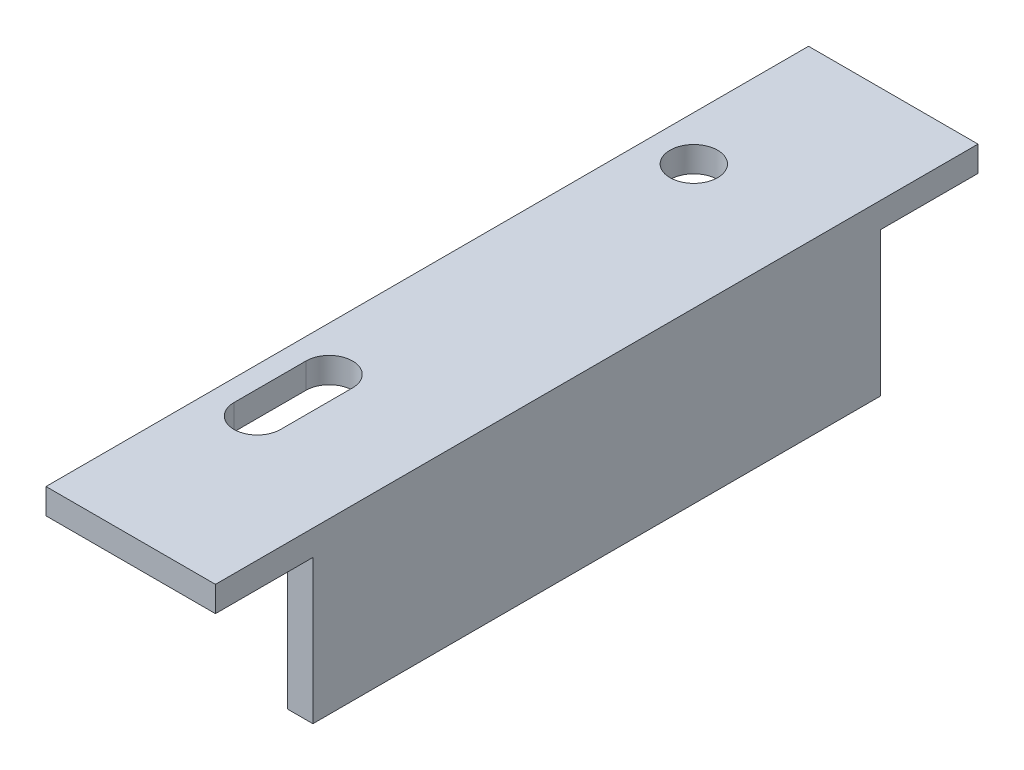
ISO-10303-21;
HEADER;
FILE_DESCRIPTION(('STEP AP214'),'2;1');
FILE_NAME('part.step','',(''),(''),'','','');
FILE_SCHEMA(('AUTOMOTIVE_DESIGN { 1 0 10303 214 1 1 1 1 }'));
ENDSEC;
DATA;
#1=APPLICATION_CONTEXT('core data for automotive mechanical design processes');
#2=APPLICATION_PROTOCOL_DEFINITION('international standard','automotive_design',2000,#1);
#3=PRODUCT_CONTEXT('',#1,'mechanical');
#4=PRODUCT('Part','Part','',(#3));
#5=PRODUCT_RELATED_PRODUCT_CATEGORY('part','',(#4));
#6=PRODUCT_DEFINITION_FORMATION('','',#4);
#7=PRODUCT_DEFINITION_CONTEXT('part definition',#1,'design');
#8=PRODUCT_DEFINITION('design','',#6,#7);
#9=PRODUCT_DEFINITION_SHAPE('','',#8);
#10=(LENGTH_UNIT() NAMED_UNIT(*) SI_UNIT(.MILLI.,.METRE.));
#11=(NAMED_UNIT(*) PLANE_ANGLE_UNIT() SI_UNIT($,.RADIAN.));
#12=(NAMED_UNIT(*) SI_UNIT($,.STERADIAN.) SOLID_ANGLE_UNIT());
#13=UNCERTAINTY_MEASURE_WITH_UNIT(LENGTH_MEASURE(1.E-05),#10,'distance_accuracy_value','');
#14=(GEOMETRIC_REPRESENTATION_CONTEXT(3) GLOBAL_UNCERTAINTY_ASSIGNED_CONTEXT((#13)) GLOBAL_UNIT_ASSIGNED_CONTEXT((#10,
#11,#12)) REPRESENTATION_CONTEXT('',''));
#15=CARTESIAN_POINT('',(0.,0.,0.));
#16=DIRECTION('',(0.,0.,1.));
#17=DIRECTION('',(1.,0.,0.));
#18=AXIS2_PLACEMENT_3D('',#15,#16,#17);
#19=CARTESIAN_POINT('',(0.,-6.,-180.));
#20=DIRECTION('',(-1.,0.,0.));
#21=DIRECTION('',(0.,0.,1.));
#22=AXIS2_PLACEMENT_3D('',#19,#20,#21);
#23=PLANE('',#22);
#24=DIRECTION('',(0.,-1.,0.));
#25=VECTOR('',#24,1.);
#26=CARTESIAN_POINT('',(0.,-6.,0.));
#27=LINE('',#26,#25);
#28=CARTESIAN_POINT('',(0.,0.,0.));
#29=VERTEX_POINT('',#28);
#30=CARTESIAN_POINT('',(0.,-6.,0.));
#31=VERTEX_POINT('',#30);
#32=EDGE_CURVE('E178',#29,#31,#27,.T.);
#33=ORIENTED_EDGE('',*,*,#32,.F.);
#34=DIRECTION('',(0.,0.,1.));
#35=VECTOR('',#34,1.);
#36=CARTESIAN_POINT('',(0.,0.,-180.));
#37=LINE('',#36,#35);
#38=CARTESIAN_POINT('',(0.,0.,-180.));
#39=VERTEX_POINT('',#38);
#40=EDGE_CURVE('E199',#39,#29,#37,.T.);
#41=ORIENTED_EDGE('',*,*,#40,.F.);
#42=DIRECTION('',(0.,-1.,0.));
#43=VECTOR('',#42,1.);
#44=CARTESIAN_POINT('',(0.,-6.,-180.));
#45=LINE('',#44,#43);
#46=CARTESIAN_POINT('',(0.,-6.,-180.));
#47=VERTEX_POINT('',#46);
#48=EDGE_CURVE('E179',#39,#47,#45,.T.);
#49=ORIENTED_EDGE('',*,*,#48,.T.);
#50=DIRECTION('',(0.,0.,1.));
#51=VECTOR('',#50,1.);
#52=CARTESIAN_POINT('',(0.,-6.,-180.));
#53=LINE('',#52,#51);
#54=EDGE_CURVE('E190',#47,#31,#53,.T.);
#55=ORIENTED_EDGE('',*,*,#54,.T.);
#56=EDGE_LOOP('',(#33,#41,#49,#55));
#57=FACE_BOUND('',#56,.T.);
#58=ADVANCED_FACE('F39',(#57),#23,.T.);
#59=CARTESIAN_POINT('',(0.,0.,-180.));
#60=DIRECTION('',(0.,1.,0.));
#61=DIRECTION('',(0.,0.,1.));
#62=AXIS2_PLACEMENT_3D('',#59,#60,#61);
#63=PLANE('',#62);
#64=CARTESIAN_POINT('',(10.52,0.,-142.4));
#65=DIRECTION('',(0.,1.,0.));
#66=DIRECTION('',(0.,0.,1.));
#67=AXIS2_PLACEMENT_3D('',#64,#65,#66);
#68=CIRCLE('',#67,5.625);
#69=CARTESIAN_POINT('',(10.52,0.,-136.775));
#70=VERTEX_POINT('',#69);
#71=EDGE_CURVE('E148',#70,#70,#68,.T.);
#72=ORIENTED_EDGE('',*,*,#71,.F.);
#73=EDGE_LOOP('',(#72));
#74=FACE_BOUND('',#73,.T.);
#75=CARTESIAN_POINT('',(10.52,0.,-56.35));
#76=DIRECTION('',(0.,1.,0.));
#77=DIRECTION('',(0.,0.,1.));
#78=AXIS2_PLACEMENT_3D('',#75,#76,#77);
#79=CIRCLE('',#78,5.5);
#80=CARTESIAN_POINT('',(16.02,0.,-56.35));
#81=VERTEX_POINT('',#80);
#82=CARTESIAN_POINT('',(5.02000000000001,0.,-56.35));
#83=VERTEX_POINT('',#82);
#84=EDGE_CURVE('E54',#81,#83,#79,.T.);
#85=ORIENTED_EDGE('',*,*,#84,.F.);
#86=DIRECTION('',(0.,0.,-1.));
#87=VECTOR('',#86,1.);
#88=CARTESIAN_POINT('',(16.02,0.,-56.35));
#89=LINE('',#88,#87);
#90=CARTESIAN_POINT('',(16.02,0.,-39.35));
#91=VERTEX_POINT('',#90);
#92=EDGE_CURVE('E135',#91,#81,#89,.T.);
#93=ORIENTED_EDGE('',*,*,#92,.F.);
#94=CARTESIAN_POINT('',(10.52,0.,-39.35));
#95=DIRECTION('',(0.,1.,0.));
#96=DIRECTION('',(0.,0.,1.));
#97=AXIS2_PLACEMENT_3D('',#94,#95,#96);
#98=CIRCLE('',#97,5.5);
#99=CARTESIAN_POINT('',(5.02000000000001,0.,-39.35));
#100=VERTEX_POINT('',#99);
#101=EDGE_CURVE('E141',#100,#91,#98,.T.);
#102=ORIENTED_EDGE('',*,*,#101,.F.);
#103=DIRECTION('',(0.,0.,1.));
#104=VECTOR('',#103,1.);
#105=CARTESIAN_POINT('',(5.02000000000001,0.,-56.35));
#106=LINE('',#105,#104);
#107=EDGE_CURVE('E147',#83,#100,#106,.T.);
#108=ORIENTED_EDGE('',*,*,#107,.F.);
#109=EDGE_LOOP('',(#85,#93,#102,#108));
#110=FACE_BOUND('',#109,.T.);
#111=DIRECTION('',(-1.,0.,0.));
#112=VECTOR('',#111,1.);
#113=CARTESIAN_POINT('',(0.,0.,0.));
#114=LINE('',#113,#112);
#115=CARTESIAN_POINT('',(40.,0.,0.));
#116=VERTEX_POINT('',#115);
#117=EDGE_CURVE('E183',#116,#29,#114,.T.);
#118=ORIENTED_EDGE('',*,*,#117,.F.);
#119=DIRECTION('',(0.,0.,1.));
#120=VECTOR('',#119,1.);
#121=CARTESIAN_POINT('',(40.,0.,-180.));
#122=LINE('',#121,#120);
#123=CARTESIAN_POINT('',(40.,0.,-180.));
#124=VERTEX_POINT('',#123);
#125=EDGE_CURVE('E202',#124,#116,#122,.T.);
#126=ORIENTED_EDGE('',*,*,#125,.F.);
#127=DIRECTION('',(-1.,0.,0.));
#128=VECTOR('',#127,1.);
#129=CARTESIAN_POINT('',(0.,0.,-180.));
#130=LINE('',#129,#128);
#131=EDGE_CURVE('E187',#124,#39,#130,.T.);
#132=ORIENTED_EDGE('',*,*,#131,.T.);
#133=ORIENTED_EDGE('',*,*,#40,.T.);
#134=EDGE_LOOP('',(#118,#126,#132,#133));
#135=FACE_BOUND('',#134,.T.);
#136=ADVANCED_FACE('F145',(#74,#110,#135),#63,.T.);
#137=CARTESIAN_POINT('',(40.,0.,-180.));
#138=DIRECTION('',(1.,0.,0.));
#139=DIRECTION('',(0.,0.,-1.));
#140=AXIS2_PLACEMENT_3D('',#137,#138,#139);
#141=PLANE('',#140);
#142=DIRECTION('',(0.,1.,0.));
#143=VECTOR('',#142,1.);
#144=CARTESIAN_POINT('',(40.,0.,-23.));
#145=LINE('',#144,#143);
#146=CARTESIAN_POINT('',(40.,-40.,-23.));
#147=VERTEX_POINT('',#146);
#148=CARTESIAN_POINT('',(40.,-6.,-23.));
#149=VERTEX_POINT('',#148);
#150=EDGE_CURVE('E176',#147,#149,#145,.T.);
#151=ORIENTED_EDGE('',*,*,#150,.F.);
#152=DIRECTION('',(0.,0.,1.));
#153=VECTOR('',#152,1.);
#154=CARTESIAN_POINT('',(40.,-40.,-180.));
#155=LINE('',#154,#153);
#156=CARTESIAN_POINT('',(40.,-40.,-157.));
#157=VERTEX_POINT('',#156);
#158=EDGE_CURVE('E205',#157,#147,#155,.T.);
#159=ORIENTED_EDGE('',*,*,#158,.F.);
#160=DIRECTION('',(0.,-1.,0.));
#161=VECTOR('',#160,1.);
#162=CARTESIAN_POINT('',(40.,0.,-157.));
#163=LINE('',#162,#161);
#164=CARTESIAN_POINT('',(40.,-6.,-157.));
#165=VERTEX_POINT('',#164);
#166=EDGE_CURVE('E174',#165,#157,#163,.T.);
#167=ORIENTED_EDGE('',*,*,#166,.F.);
#168=DIRECTION('',(0.,0.,1.));
#169=VECTOR('',#168,1.);
#170=CARTESIAN_POINT('',(40.,-6.,-180.));
#171=LINE('',#170,#169);
#172=CARTESIAN_POINT('',(40.,-6.,-180.));
#173=VERTEX_POINT('',#172);
#174=EDGE_CURVE('E172',#173,#165,#171,.T.);
#175=ORIENTED_EDGE('',*,*,#174,.F.);
#176=DIRECTION('',(0.,1.,0.));
#177=VECTOR('',#176,1.);
#178=CARTESIAN_POINT('',(40.,0.,-180.));
#179=LINE('',#178,#177);
#180=EDGE_CURVE('E185',#173,#124,#179,.T.);
#181=ORIENTED_EDGE('',*,*,#180,.T.);
#182=ORIENTED_EDGE('',*,*,#125,.T.);
#183=DIRECTION('',(0.,1.,0.));
#184=VECTOR('',#183,1.);
#185=CARTESIAN_POINT('',(40.,0.,0.));
#186=LINE('',#185,#184);
#187=CARTESIAN_POINT('',(40.,-6.,0.));
#188=VERTEX_POINT('',#187);
#189=EDGE_CURVE('E195',#188,#116,#186,.T.);
#190=ORIENTED_EDGE('',*,*,#189,.F.);
#191=DIRECTION('',(0.,0.,1.));
#192=VECTOR('',#191,1.);
#193=CARTESIAN_POINT('',(40.,-6.00000000000002,-180.));
#194=LINE('',#193,#192);
#195=EDGE_CURVE('E162',#149,#188,#194,.T.);
#196=ORIENTED_EDGE('',*,*,#195,.F.);
#197=EDGE_LOOP('',(#151,#159,#167,#175,#181,#182,#190,#196));
#198=FACE_BOUND('',#197,.T.);
#199=ADVANCED_FACE('F246',(#198),#141,.T.);
#200=CARTESIAN_POINT('',(34.,-40.,-180.));
#201=DIRECTION('',(0.,-1.,0.));
#202=DIRECTION('',(0.,0.,-1.));
#203=AXIS2_PLACEMENT_3D('',#200,#201,#202);
#204=PLANE('',#203);
#205=DIRECTION('',(-1.,0.,0.));
#206=VECTOR('',#205,1.);
#207=CARTESIAN_POINT('',(234.,-40.,-23.));
#208=LINE('',#207,#206);
#209=CARTESIAN_POINT('',(34.,-40.,-23.));
#210=VERTEX_POINT('',#209);
#211=EDGE_CURVE('E159',#147,#210,#208,.T.);
#212=ORIENTED_EDGE('',*,*,#211,.T.);
#213=DIRECTION('',(0.,0.,1.));
#214=VECTOR('',#213,1.);
#215=CARTESIAN_POINT('',(34.,-40.,-180.));
#216=LINE('',#215,#214);
#217=CARTESIAN_POINT('',(34.,-40.,-157.));
#218=VERTEX_POINT('',#217);
#219=EDGE_CURVE('E208',#218,#210,#216,.T.);
#220=ORIENTED_EDGE('',*,*,#219,.F.);
#221=DIRECTION('',(-1.,0.,0.));
#222=VECTOR('',#221,1.);
#223=CARTESIAN_POINT('',(234.,-40.,-157.));
#224=LINE('',#223,#222);
#225=EDGE_CURVE('E164',#157,#218,#224,.T.);
#226=ORIENTED_EDGE('',*,*,#225,.F.);
#227=ORIENTED_EDGE('',*,*,#158,.T.);
#228=EDGE_LOOP('',(#212,#220,#226,#227));
#229=FACE_BOUND('',#228,.T.);
#230=ADVANCED_FACE('F274',(#229),#204,.T.);
#231=CARTESIAN_POINT('',(34.,-6.,-180.));
#232=DIRECTION('',(-1.,0.,0.));
#233=DIRECTION('',(0.,0.,1.));
#234=AXIS2_PLACEMENT_3D('',#231,#232,#233);
#235=PLANE('',#234);
#236=DIRECTION('',(0.,-1.,0.));
#237=VECTOR('',#236,1.);
#238=CARTESIAN_POINT('',(34.,-6.,-23.));
#239=LINE('',#238,#237);
#240=CARTESIAN_POINT('',(34.,-6.,-23.));
#241=VERTEX_POINT('',#240);
#242=EDGE_CURVE('E155',#241,#210,#239,.T.);
#243=ORIENTED_EDGE('',*,*,#242,.F.);
#244=DIRECTION('',(0.,0.,1.));
#245=VECTOR('',#244,1.);
#246=CARTESIAN_POINT('',(34.,-6.,-180.));
#247=LINE('',#246,#245);
#248=CARTESIAN_POINT('',(34.,-6.,-157.));
#249=VERTEX_POINT('',#248);
#250=EDGE_CURVE('E211',#249,#241,#247,.T.);
#251=ORIENTED_EDGE('',*,*,#250,.F.);
#252=DIRECTION('',(0.,1.,0.));
#253=VECTOR('',#252,1.);
#254=CARTESIAN_POINT('',(34.,-6.,-157.));
#255=LINE('',#254,#253);
#256=EDGE_CURVE('E158',#218,#249,#255,.T.);
#257=ORIENTED_EDGE('',*,*,#256,.F.);
#258=ORIENTED_EDGE('',*,*,#219,.T.);
#259=EDGE_LOOP('',(#243,#251,#257,#258));
#260=FACE_BOUND('',#259,.T.);
#261=ADVANCED_FACE('F277',(#260),#235,.T.);
#262=CARTESIAN_POINT('',(0.,-6.,-180.));
#263=DIRECTION('',(0.,-1.,0.));
#264=DIRECTION('',(0.,0.,-1.));
#265=AXIS2_PLACEMENT_3D('',#262,#263,#264);
#266=PLANE('',#265);
#267=CARTESIAN_POINT('',(10.52,-6.00000000000001,-142.4));
#268=DIRECTION('',(0.,-1.,0.));
#269=DIRECTION('',(0.,0.,-1.));
#270=AXIS2_PLACEMENT_3D('',#267,#268,#269);
#271=CIRCLE('',#270,5.625);
#272=CARTESIAN_POINT('',(10.52,-6.00000000000001,-148.025));
#273=VERTEX_POINT('',#272);
#274=EDGE_CURVE('E42',#273,#273,#271,.T.);
#275=ORIENTED_EDGE('',*,*,#274,.F.);
#276=EDGE_LOOP('',(#275));
#277=FACE_BOUND('',#276,.T.);
#278=CARTESIAN_POINT('',(10.52,-6.00000000000001,-56.35));
#279=DIRECTION('',(0.,-1.,0.));
#280=DIRECTION('',(0.,0.,-1.));
#281=AXIS2_PLACEMENT_3D('',#278,#279,#280);
#282=CIRCLE('',#281,5.5);
#283=CARTESIAN_POINT('',(5.02000000000001,-6.00000000000001,-56.35));
#284=VERTEX_POINT('',#283);
#285=CARTESIAN_POINT('',(16.02,-6.00000000000001,-56.35));
#286=VERTEX_POINT('',#285);
#287=EDGE_CURVE('E11',#284,#286,#282,.T.);
#288=ORIENTED_EDGE('',*,*,#287,.F.);
#289=DIRECTION('',(0.,0.,-1.));
#290=VECTOR('',#289,1.);
#291=CARTESIAN_POINT('',(5.02000000000001,-6.,-180.));
#292=LINE('',#291,#290);
#293=CARTESIAN_POINT('',(5.02000000000001,-6.,-39.35));
#294=VERTEX_POINT('',#293);
#295=EDGE_CURVE('E201',#294,#284,#292,.T.);
#296=ORIENTED_EDGE('',*,*,#295,.F.);
#297=CARTESIAN_POINT('',(10.52,-6.00000000000001,-39.35));
#298=DIRECTION('',(0.,-1.,0.));
#299=DIRECTION('',(0.,0.,-1.));
#300=AXIS2_PLACEMENT_3D('',#297,#298,#299);
#301=CIRCLE('',#300,5.5);
#302=CARTESIAN_POINT('',(16.02,-6.00000000000001,-39.35));
#303=VERTEX_POINT('',#302);
#304=EDGE_CURVE('E216',#303,#294,#301,.T.);
#305=ORIENTED_EDGE('',*,*,#304,.F.);
#306=DIRECTION('',(0.,0.,1.));
#307=VECTOR('',#306,1.);
#308=CARTESIAN_POINT('',(16.02,-6.,-180.));
#309=LINE('',#308,#307);
#310=EDGE_CURVE('E47',#286,#303,#309,.T.);
#311=ORIENTED_EDGE('',*,*,#310,.F.);
#312=EDGE_LOOP('',(#288,#296,#305,#311));
#313=FACE_BOUND('',#312,.T.);
#314=DIRECTION('',(1.,0.,0.));
#315=VECTOR('',#314,1.);
#316=CARTESIAN_POINT('',(0.,-6.,0.));
#317=LINE('',#316,#315);
#318=EDGE_CURVE('E193',#31,#188,#317,.T.);
#319=ORIENTED_EDGE('',*,*,#318,.F.);
#320=ORIENTED_EDGE('',*,*,#54,.F.);
#321=DIRECTION('',(1.,0.,0.));
#322=VECTOR('',#321,1.);
#323=CARTESIAN_POINT('',(0.,-6.,-180.));
#324=LINE('',#323,#322);
#325=EDGE_CURVE('E182',#47,#173,#324,.T.);
#326=ORIENTED_EDGE('',*,*,#325,.T.);
#327=ORIENTED_EDGE('',*,*,#174,.T.);
#328=DIRECTION('',(-1.,0.,0.));
#329=VECTOR('',#328,1.);
#330=CARTESIAN_POINT('',(234.,-6.,-157.));
#331=LINE('',#330,#329);
#332=EDGE_CURVE('E166',#165,#249,#331,.T.);
#333=ORIENTED_EDGE('',*,*,#332,.T.);
#334=ORIENTED_EDGE('',*,*,#250,.T.);
#335=DIRECTION('',(-1.,0.,0.));
#336=VECTOR('',#335,1.);
#337=CARTESIAN_POINT('',(234.,-6.,-23.));
#338=LINE('',#337,#336);
#339=EDGE_CURVE('E157',#149,#241,#338,.T.);
#340=ORIENTED_EDGE('',*,*,#339,.F.);
#341=ORIENTED_EDGE('',*,*,#195,.T.);
#342=EDGE_LOOP('',(#319,#320,#326,#327,#333,#334,#340,#341));
#343=FACE_BOUND('',#342,.T.);
#344=ADVANCED_FACE('F224',(#277,#313,#343),#266,.T.);
#345=CARTESIAN_POINT('',(0.,0.,-180.));
#346=DIRECTION('',(0.,0.,-1.));
#347=DIRECTION('',(-1.,0.,0.));
#348=AXIS2_PLACEMENT_3D('',#345,#346,#347);
#349=PLANE('',#348);
#350=ORIENTED_EDGE('',*,*,#180,.F.);
#351=ORIENTED_EDGE('',*,*,#325,.F.);
#352=ORIENTED_EDGE('',*,*,#48,.F.);
#353=ORIENTED_EDGE('',*,*,#131,.F.);
#354=EDGE_LOOP('',(#350,#351,#352,#353));
#355=FACE_BOUND('',#354,.T.);
#356=ADVANCED_FACE('F260',(#355),#349,.T.);
#357=CARTESIAN_POINT('',(0.,0.,0.));
#358=DIRECTION('',(0.,0.,-1.));
#359=DIRECTION('',(-1.,0.,0.));
#360=AXIS2_PLACEMENT_3D('',#357,#358,#359);
#361=PLANE('',#360);
#362=ORIENTED_EDGE('',*,*,#318,.T.);
#363=ORIENTED_EDGE('',*,*,#189,.T.);
#364=ORIENTED_EDGE('',*,*,#117,.T.);
#365=ORIENTED_EDGE('',*,*,#32,.T.);
#366=EDGE_LOOP('',(#362,#363,#364,#365));
#367=FACE_BOUND('',#366,.T.);
#368=ADVANCED_FACE('F254',(#367),#361,.F.);
#369=CARTESIAN_POINT('',(234.,-6.,-23.));
#370=DIRECTION('',(0.,0.,-1.));
#371=DIRECTION('',(0.,1.,0.));
#372=AXIS2_PLACEMENT_3D('',#369,#370,#371);
#373=PLANE('',#372);
#374=ORIENTED_EDGE('',*,*,#150,.T.);
#375=ORIENTED_EDGE('',*,*,#339,.T.);
#376=ORIENTED_EDGE('',*,*,#242,.T.);
#377=ORIENTED_EDGE('',*,*,#211,.F.);
#378=EDGE_LOOP('',(#374,#375,#376,#377));
#379=FACE_BOUND('',#378,.T.);
#380=ADVANCED_FACE('F282',(#379),#373,.F.);
#381=CARTESIAN_POINT('',(234.,-6.,-157.));
#382=DIRECTION('',(0.,0.,1.));
#383=DIRECTION('',(1.,0.,0.));
#384=AXIS2_PLACEMENT_3D('',#381,#382,#383);
#385=PLANE('',#384);
#386=ORIENTED_EDGE('',*,*,#166,.T.);
#387=ORIENTED_EDGE('',*,*,#225,.T.);
#388=ORIENTED_EDGE('',*,*,#256,.T.);
#389=ORIENTED_EDGE('',*,*,#332,.F.);
#390=EDGE_LOOP('',(#386,#387,#388,#389));
#391=FACE_BOUND('',#390,.T.);
#392=ADVANCED_FACE('F270',(#391),#385,.F.);
#393=CARTESIAN_POINT('',(10.52,-200.,-56.35));
#394=DIRECTION('',(0.,1.,0.));
#395=DIRECTION('',(0.,0.,1.));
#396=AXIS2_PLACEMENT_3D('',#393,#394,#395);
#397=CYLINDRICAL_SURFACE('',#396,5.5);
#398=ORIENTED_EDGE('',*,*,#287,.T.);
#399=DIRECTION('',(0.,1.,0.));
#400=VECTOR('',#399,1.);
#401=CARTESIAN_POINT('',(16.02,-200.,-56.35));
#402=LINE('',#401,#400);
#403=EDGE_CURVE('E126',#286,#81,#402,.T.);
#404=ORIENTED_EDGE('',*,*,#403,.T.);
#405=ORIENTED_EDGE('',*,*,#84,.T.);
#406=DIRECTION('',(0.,1.,0.));
#407=VECTOR('',#406,1.);
#408=CARTESIAN_POINT('',(5.02000000000001,-200.,-56.35));
#409=LINE('',#408,#407);
#410=EDGE_CURVE('E142',#284,#83,#409,.T.);
#411=ORIENTED_EDGE('',*,*,#410,.F.);
#412=EDGE_LOOP('',(#398,#404,#405,#411));
#413=FACE_BOUND('',#412,.T.);
#414=ADVANCED_FACE('F128',(#413),#397,.F.);
#415=CARTESIAN_POINT('',(16.02,-200.,-56.35));
#416=DIRECTION('',(1.,0.,0.));
#417=DIRECTION('',(0.,0.,-1.));
#418=AXIS2_PLACEMENT_3D('',#415,#416,#417);
#419=PLANE('',#418);
#420=ORIENTED_EDGE('',*,*,#310,.T.);
#421=DIRECTION('',(0.,1.,0.));
#422=VECTOR('',#421,1.);
#423=CARTESIAN_POINT('',(16.02,-200.,-39.35));
#424=LINE('',#423,#422);
#425=EDGE_CURVE('E132',#303,#91,#424,.T.);
#426=ORIENTED_EDGE('',*,*,#425,.T.);
#427=ORIENTED_EDGE('',*,*,#92,.T.);
#428=ORIENTED_EDGE('',*,*,#403,.F.);
#429=EDGE_LOOP('',(#420,#426,#427,#428));
#430=FACE_BOUND('',#429,.T.);
#431=ADVANCED_FACE('F136',(#430),#419,.F.);
#432=CARTESIAN_POINT('',(10.52,-200.,-39.35));
#433=DIRECTION('',(0.,1.,0.));
#434=DIRECTION('',(0.,0.,1.));
#435=AXIS2_PLACEMENT_3D('',#432,#433,#434);
#436=CYLINDRICAL_SURFACE('',#435,5.5);
#437=ORIENTED_EDGE('',*,*,#304,.T.);
#438=DIRECTION('',(0.,1.,0.));
#439=VECTOR('',#438,1.);
#440=CARTESIAN_POINT('',(5.02000000000001,-200.,-39.35));
#441=LINE('',#440,#439);
#442=EDGE_CURVE('E62',#294,#100,#441,.T.);
#443=ORIENTED_EDGE('',*,*,#442,.T.);
#444=ORIENTED_EDGE('',*,*,#101,.T.);
#445=ORIENTED_EDGE('',*,*,#425,.F.);
#446=EDGE_LOOP('',(#437,#443,#444,#445));
#447=FACE_BOUND('',#446,.T.);
#448=ADVANCED_FACE('F221',(#447),#436,.F.);
#449=CARTESIAN_POINT('',(5.02000000000001,-200.,-56.35));
#450=DIRECTION('',(-1.,0.,0.));
#451=DIRECTION('',(0.,0.,1.));
#452=AXIS2_PLACEMENT_3D('',#449,#450,#451);
#453=PLANE('',#452);
#454=ORIENTED_EDGE('',*,*,#295,.T.);
#455=ORIENTED_EDGE('',*,*,#410,.T.);
#456=ORIENTED_EDGE('',*,*,#107,.T.);
#457=ORIENTED_EDGE('',*,*,#442,.F.);
#458=EDGE_LOOP('',(#454,#455,#456,#457));
#459=FACE_BOUND('',#458,.T.);
#460=ADVANCED_FACE('F226',(#459),#453,.F.);
#461=CARTESIAN_POINT('',(10.52,-200.,-142.4));
#462=DIRECTION('',(0.,1.,0.));
#463=DIRECTION('',(0.,0.,1.));
#464=AXIS2_PLACEMENT_3D('',#461,#462,#463);
#465=CYLINDRICAL_SURFACE('',#464,5.625);
#466=ORIENTED_EDGE('',*,*,#274,.T.);
#467=EDGE_LOOP('',(#466));
#468=FACE_BOUND('',#467,.T.);
#469=ORIENTED_EDGE('',*,*,#71,.T.);
#470=EDGE_LOOP('',(#469));
#471=FACE_BOUND('',#470,.T.);
#472=ADVANCED_FACE('F230',(#468,#471),#465,.F.);
#473=CLOSED_SHELL('',(#58,#136,#199,#230,#261,#344,#356,#368,#380,#392,#414,#431,#448,#460,#472));
#474=MANIFOLD_SOLID_BREP('B2',#473);
#475=ADVANCED_BREP_SHAPE_REPRESENTATION('',(#18,#474),#14);
#476=SHAPE_DEFINITION_REPRESENTATION(#9,#475);
ENDSEC;
END-ISO-10303-21;
